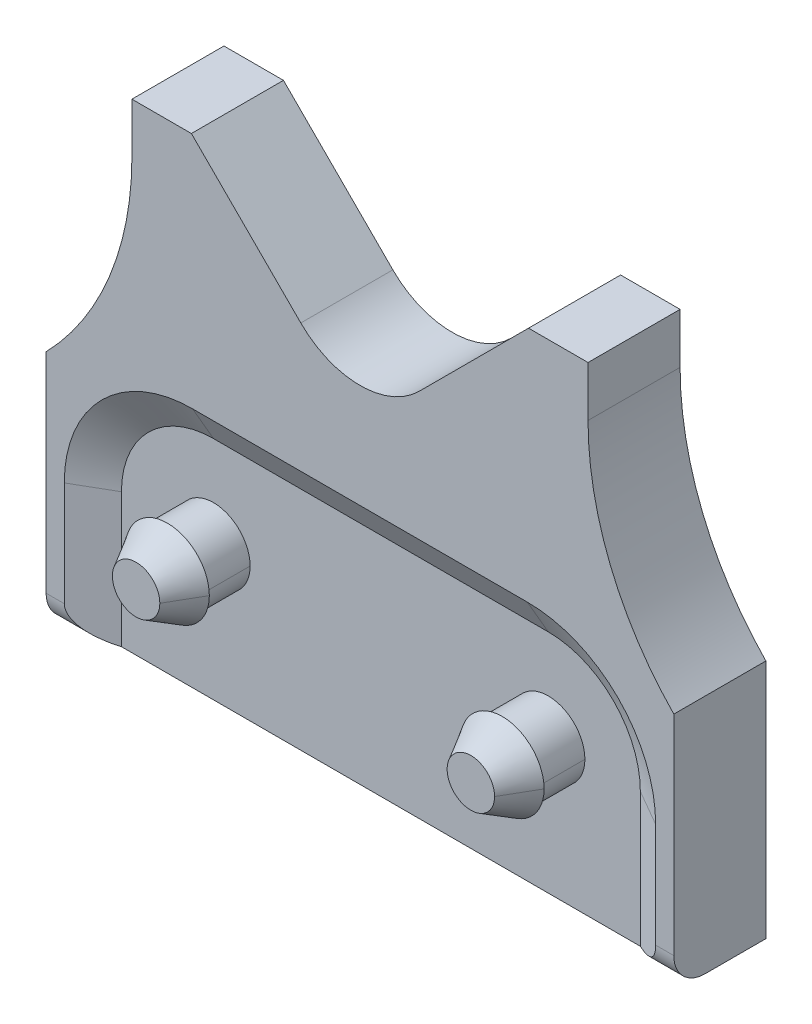
ISO-10303-21;
HEADER;
FILE_DESCRIPTION(('STEP AP214'),'2;1');
FILE_NAME('part.step','',(''),(''),'','','');
FILE_SCHEMA(('AUTOMOTIVE_DESIGN { 1 0 10303 214 1 1 1 1 }'));
ENDSEC;
DATA;
#1=APPLICATION_CONTEXT('core data for automotive mechanical design processes');
#2=APPLICATION_PROTOCOL_DEFINITION('international standard','automotive_design',2000,#1);
#3=PRODUCT_CONTEXT('',#1,'mechanical');
#4=PRODUCT('Part','Part','',(#3));
#5=PRODUCT_RELATED_PRODUCT_CATEGORY('part','',(#4));
#6=PRODUCT_DEFINITION_FORMATION('','',#4);
#7=PRODUCT_DEFINITION_CONTEXT('part definition',#1,'design');
#8=PRODUCT_DEFINITION('design','',#6,#7);
#9=PRODUCT_DEFINITION_SHAPE('','',#8);
#10=(LENGTH_UNIT() NAMED_UNIT(*) SI_UNIT(.MILLI.,.METRE.));
#11=(NAMED_UNIT(*) PLANE_ANGLE_UNIT() SI_UNIT($,.RADIAN.));
#12=(NAMED_UNIT(*) SI_UNIT($,.STERADIAN.) SOLID_ANGLE_UNIT());
#13=UNCERTAINTY_MEASURE_WITH_UNIT(LENGTH_MEASURE(1.E-05),#10,'distance_accuracy_value','');
#14=(GEOMETRIC_REPRESENTATION_CONTEXT(3) GLOBAL_UNCERTAINTY_ASSIGNED_CONTEXT((#13)) GLOBAL_UNIT_ASSIGNED_CONTEXT((#10,
#11,#12)) REPRESENTATION_CONTEXT('',''));
#15=CARTESIAN_POINT('',(0.,0.,0.));
#16=DIRECTION('',(0.,0.,1.));
#17=DIRECTION('',(1.,0.,0.));
#18=AXIS2_PLACEMENT_3D('',#15,#16,#17);
#19=CARTESIAN_POINT('',(-4.,-7.55,-0.5));
#20=DIRECTION('',(0.,0.,-1.));
#21=DIRECTION('',(-1.,0.,0.));
#22=AXIS2_PLACEMENT_3D('',#19,#20,#21);
#23=CYLINDRICAL_SURFACE('',#22,0.375);
#24=CARTESIAN_POINT('',(-4.,-7.55,-0.5));
#25=DIRECTION('',(0.,0.,-1.));
#26=DIRECTION('',(1.,0.,0.));
#27=AXIS2_PLACEMENT_3D('',#24,#25,#26);
#28=CIRCLE('',#27,0.375);
#29=CARTESIAN_POINT('',(-3.625,-7.55,-0.5));
#30=VERTEX_POINT('',#29);
#31=CARTESIAN_POINT('',(-4.375,-7.55,-0.5));
#32=VERTEX_POINT('',#31);
#33=EDGE_CURVE('E41',#30,#32,#28,.T.);
#34=ORIENTED_EDGE('',*,*,#33,.F.);
#35=DIRECTION('',(0.,0.,-1.));
#36=VECTOR('',#35,1.);
#37=CARTESIAN_POINT('',(-3.625,-7.55,-0.5));
#38=LINE('',#37,#36);
#39=CARTESIAN_POINT('',(-3.625,-7.55,-3.2));
#40=VERTEX_POINT('',#39);
#41=EDGE_CURVE('E11',#30,#40,#38,.T.);
#42=ORIENTED_EDGE('',*,*,#41,.T.);
#43=CARTESIAN_POINT('',(-4.,-7.55,-3.2));
#44=DIRECTION('',(0.,0.,1.));
#45=DIRECTION('',(-1.,0.,0.));
#46=AXIS2_PLACEMENT_3D('',#43,#44,#45);
#47=CIRCLE('',#46,0.375);
#48=CARTESIAN_POINT('',(-4.375,-7.55,-3.2));
#49=VERTEX_POINT('',#48);
#50=EDGE_CURVE('E527',#49,#40,#47,.T.);
#51=ORIENTED_EDGE('',*,*,#50,.F.);
#52=DIRECTION('',(0.,0.,-1.));
#53=VECTOR('',#52,1.);
#54=CARTESIAN_POINT('',(-4.375,-7.55,-0.5));
#55=LINE('',#54,#53);
#56=EDGE_CURVE('E328',#32,#49,#55,.T.);
#57=ORIENTED_EDGE('',*,*,#56,.F.);
#58=EDGE_LOOP('',(#34,#42,#51,#57));
#59=FACE_BOUND('',#58,.T.);
#60=ADVANCED_FACE('F17',(#59),#23,.F.);
#61=CARTESIAN_POINT('',(4.,-7.55,-0.5));
#62=DIRECTION('',(0.,0.,-1.));
#63=DIRECTION('',(-1.,0.,0.));
#64=AXIS2_PLACEMENT_3D('',#61,#62,#63);
#65=CYLINDRICAL_SURFACE('',#64,0.375);
#66=CARTESIAN_POINT('',(4.,-7.55,-0.5));
#67=DIRECTION('',(0.,0.,-1.));
#68=DIRECTION('',(1.,0.,0.));
#69=AXIS2_PLACEMENT_3D('',#66,#67,#68);
#70=CIRCLE('',#69,0.375);
#71=CARTESIAN_POINT('',(4.375,-7.55,-0.5));
#72=VERTEX_POINT('',#71);
#73=CARTESIAN_POINT('',(3.625,-7.55,-0.5));
#74=VERTEX_POINT('',#73);
#75=EDGE_CURVE('E324',#72,#74,#70,.T.);
#76=ORIENTED_EDGE('',*,*,#75,.F.);
#77=DIRECTION('',(0.,0.,-1.));
#78=VECTOR('',#77,1.);
#79=CARTESIAN_POINT('',(4.375,-7.55,-0.5));
#80=LINE('',#79,#78);
#81=CARTESIAN_POINT('',(4.375,-7.55,-3.2));
#82=VERTEX_POINT('',#81);
#83=EDGE_CURVE('E21',#72,#82,#80,.T.);
#84=ORIENTED_EDGE('',*,*,#83,.T.);
#85=CARTESIAN_POINT('',(4.,-7.55,-3.2));
#86=DIRECTION('',(0.,0.,1.));
#87=DIRECTION('',(-1.,0.,0.));
#88=AXIS2_PLACEMENT_3D('',#85,#86,#87);
#89=CIRCLE('',#88,0.375);
#90=CARTESIAN_POINT('',(3.625,-7.55,-3.2));
#91=VERTEX_POINT('',#90);
#92=EDGE_CURVE('E407',#91,#82,#89,.T.);
#93=ORIENTED_EDGE('',*,*,#92,.F.);
#94=DIRECTION('',(0.,0.,-1.));
#95=VECTOR('',#94,1.);
#96=CARTESIAN_POINT('',(3.625,-7.55,-0.5));
#97=LINE('',#96,#95);
#98=EDGE_CURVE('E381',#74,#91,#97,.T.);
#99=ORIENTED_EDGE('',*,*,#98,.F.);
#100=EDGE_LOOP('',(#76,#84,#93,#99));
#101=FACE_BOUND('',#100,.T.);
#102=ADVANCED_FACE('F986',(#101),#65,.F.);
#103=CARTESIAN_POINT('',(-4.,-7.55,0.35));
#104=DIRECTION('',(0.,0.,-1.));
#105=DIRECTION('',(-1.,0.,0.));
#106=AXIS2_PLACEMENT_3D('',#103,#104,#105);
#107=CONICAL_SURFACE('',#106,0.566987298107781,0.523598775598299);
#108=CARTESIAN_POINT('',(-4.,-7.55,0.35));
#109=DIRECTION('',(0.,0.,1.));
#110=DIRECTION('',(1.,0.,0.));
#111=AXIS2_PLACEMENT_3D('',#108,#109,#110);
#112=CIRCLE('',#111,0.566987298107781);
#113=CARTESIAN_POINT('',(-3.43301270189222,-7.55,0.35));
#114=VERTEX_POINT('',#113);
#115=CARTESIAN_POINT('',(-4.56698729810778,-7.55,0.35));
#116=VERTEX_POINT('',#115);
#117=EDGE_CURVE('E263',#114,#116,#112,.T.);
#118=ORIENTED_EDGE('',*,*,#117,.F.);
#119=DIRECTION('',(0.5,0.,-0.866025403784439));
#120=VECTOR('',#119,1.);
#121=CARTESIAN_POINT('',(-3.43301270189222,-7.55,0.35));
#122=LINE('',#121,#120);
#123=CARTESIAN_POINT('',(-3.,-7.55,-0.4));
#124=VERTEX_POINT('',#123);
#125=EDGE_CURVE('E419',#114,#124,#122,.T.);
#126=ORIENTED_EDGE('',*,*,#125,.T.);
#127=CARTESIAN_POINT('',(-4.,-7.55,-0.4));
#128=DIRECTION('',(0.,0.,1.));
#129=DIRECTION('',(1.,0.,0.));
#130=AXIS2_PLACEMENT_3D('',#127,#128,#129);
#131=CIRCLE('',#130,1.);
#132=CARTESIAN_POINT('',(-5.,-7.55,-0.4));
#133=VERTEX_POINT('',#132);
#134=EDGE_CURVE('E368',#124,#133,#131,.T.);
#135=ORIENTED_EDGE('',*,*,#134,.T.);
#136=DIRECTION('',(-0.5,0.,-0.866025403784439));
#137=VECTOR('',#136,1.);
#138=CARTESIAN_POINT('',(-4.56698729810778,-7.55,0.35));
#139=LINE('',#138,#137);
#140=EDGE_CURVE('E300',#116,#133,#139,.T.);
#141=ORIENTED_EDGE('',*,*,#140,.F.);
#142=EDGE_LOOP('',(#118,#126,#135,#141));
#143=FACE_BOUND('',#142,.T.);
#144=ADVANCED_FACE('F990',(#143),#107,.T.);
#145=CARTESIAN_POINT('',(4.,-7.55,0.35));
#146=DIRECTION('',(0.,0.,-1.));
#147=DIRECTION('',(-1.,0.,0.));
#148=AXIS2_PLACEMENT_3D('',#145,#146,#147);
#149=CONICAL_SURFACE('',#148,0.566987298107781,0.523598775598299);
#150=CARTESIAN_POINT('',(4.,-7.55,0.35));
#151=DIRECTION('',(0.,0.,1.));
#152=DIRECTION('',(1.,0.,0.));
#153=AXIS2_PLACEMENT_3D('',#150,#151,#152);
#154=CIRCLE('',#153,0.566987298107781);
#155=CARTESIAN_POINT('',(4.56698729810778,-7.55,0.35));
#156=VERTEX_POINT('',#155);
#157=CARTESIAN_POINT('',(3.43301270189222,-7.55,0.35));
#158=VERTEX_POINT('',#157);
#159=EDGE_CURVE('E223',#156,#158,#154,.T.);
#160=ORIENTED_EDGE('',*,*,#159,.F.);
#161=DIRECTION('',(0.5,0.,-0.866025403784439));
#162=VECTOR('',#161,1.);
#163=CARTESIAN_POINT('',(4.56698729810778,-7.55,0.35));
#164=LINE('',#163,#162);
#165=CARTESIAN_POINT('',(5.,-7.55,-0.4));
#166=VERTEX_POINT('',#165);
#167=EDGE_CURVE('E364',#156,#166,#164,.T.);
#168=ORIENTED_EDGE('',*,*,#167,.T.);
#169=CARTESIAN_POINT('',(4.,-7.55,-0.4));
#170=DIRECTION('',(0.,0.,1.));
#171=DIRECTION('',(1.,0.,0.));
#172=AXIS2_PLACEMENT_3D('',#169,#170,#171);
#173=CIRCLE('',#172,1.);
#174=CARTESIAN_POINT('',(3.,-7.55,-0.4));
#175=VERTEX_POINT('',#174);
#176=EDGE_CURVE('E227',#166,#175,#173,.T.);
#177=ORIENTED_EDGE('',*,*,#176,.T.);
#178=DIRECTION('',(-0.5,0.,-0.866025403784439));
#179=VECTOR('',#178,1.);
#180=CARTESIAN_POINT('',(3.43301270189222,-7.55,0.35));
#181=LINE('',#180,#179);
#182=EDGE_CURVE('E268',#158,#175,#181,.T.);
#183=ORIENTED_EDGE('',*,*,#182,.F.);
#184=EDGE_LOOP('',(#160,#168,#177,#183));
#185=FACE_BOUND('',#184,.T.);
#186=ADVANCED_FACE('F1025',(#185),#149,.T.);
#187=CARTESIAN_POINT('',(-4.,-7.55,-5.81));
#188=DIRECTION('',(0.,0.,1.));
#189=DIRECTION('',(1.,0.,0.));
#190=AXIS2_PLACEMENT_3D('',#187,#188,#189);
#191=CYLINDRICAL_SURFACE('',#190,0.875);
#192=CARTESIAN_POINT('',(-4.,-7.55,-1.5));
#193=DIRECTION('',(0.,0.,-1.));
#194=DIRECTION('',(-1.,0.,0.));
#195=AXIS2_PLACEMENT_3D('',#192,#193,#194);
#196=CIRCLE('',#195,0.875);
#197=CARTESIAN_POINT('',(-4.875,-7.55,-1.5));
#198=VERTEX_POINT('',#197);
#199=CARTESIAN_POINT('',(-3.125,-7.55,-1.5));
#200=VERTEX_POINT('',#199);
#201=EDGE_CURVE('E319',#198,#200,#196,.T.);
#202=ORIENTED_EDGE('',*,*,#201,.F.);
#203=DIRECTION('',(0.,0.,1.));
#204=VECTOR('',#203,1.);
#205=CARTESIAN_POINT('',(-4.875,-7.55,-5.81));
#206=LINE('',#205,#204);
#207=CARTESIAN_POINT('',(-4.875,-7.55,-0.4));
#208=VERTEX_POINT('',#207);
#209=EDGE_CURVE('E329',#198,#208,#206,.T.);
#210=ORIENTED_EDGE('',*,*,#209,.T.);
#211=CARTESIAN_POINT('',(-4.,-7.55,-0.4));
#212=DIRECTION('',(0.,0.,1.));
#213=DIRECTION('',(1.,0.,0.));
#214=AXIS2_PLACEMENT_3D('',#211,#212,#213);
#215=CIRCLE('',#214,0.875);
#216=CARTESIAN_POINT('',(-3.125,-7.55,-0.4));
#217=VERTEX_POINT('',#216);
#218=EDGE_CURVE('E285',#217,#208,#215,.T.);
#219=ORIENTED_EDGE('',*,*,#218,.F.);
#220=DIRECTION('',(0.,0.,1.));
#221=VECTOR('',#220,1.);
#222=CARTESIAN_POINT('',(-3.125,-7.55,-5.81));
#223=LINE('',#222,#221);
#224=EDGE_CURVE('E203',#200,#217,#223,.T.);
#225=ORIENTED_EDGE('',*,*,#224,.F.);
#226=EDGE_LOOP('',(#202,#210,#219,#225));
#227=FACE_BOUND('',#226,.T.);
#228=ADVANCED_FACE('F1021',(#227),#191,.T.);
#229=CARTESIAN_POINT('',(4.,-7.55,-5.81));
#230=DIRECTION('',(0.,0.,1.));
#231=DIRECTION('',(1.,0.,0.));
#232=AXIS2_PLACEMENT_3D('',#229,#230,#231);
#233=CYLINDRICAL_SURFACE('',#232,0.875);
#234=CARTESIAN_POINT('',(4.,-7.55,-1.5));
#235=DIRECTION('',(0.,0.,-1.));
#236=DIRECTION('',(-1.,0.,0.));
#237=AXIS2_PLACEMENT_3D('',#234,#235,#236);
#238=CIRCLE('',#237,0.875);
#239=CARTESIAN_POINT('',(3.125,-7.55,-1.5));
#240=VERTEX_POINT('',#239);
#241=CARTESIAN_POINT('',(4.875,-7.55,-1.5));
#242=VERTEX_POINT('',#241);
#243=EDGE_CURVE('E212',#240,#242,#238,.T.);
#244=ORIENTED_EDGE('',*,*,#243,.F.);
#245=DIRECTION('',(0.,0.,1.));
#246=VECTOR('',#245,1.);
#247=CARTESIAN_POINT('',(3.125,-7.55,-5.81));
#248=LINE('',#247,#246);
#249=CARTESIAN_POINT('',(3.125,-7.55,-0.4));
#250=VERTEX_POINT('',#249);
#251=EDGE_CURVE('E198',#240,#250,#248,.T.);
#252=ORIENTED_EDGE('',*,*,#251,.T.);
#253=CARTESIAN_POINT('',(4.,-7.55,-0.4));
#254=DIRECTION('',(0.,0.,1.));
#255=DIRECTION('',(1.,0.,0.));
#256=AXIS2_PLACEMENT_3D('',#253,#254,#255);
#257=CIRCLE('',#256,0.875);
#258=CARTESIAN_POINT('',(4.875,-7.55,-0.4));
#259=VERTEX_POINT('',#258);
#260=EDGE_CURVE('E191',#259,#250,#257,.T.);
#261=ORIENTED_EDGE('',*,*,#260,.F.);
#262=DIRECTION('',(0.,0.,1.));
#263=VECTOR('',#262,1.);
#264=CARTESIAN_POINT('',(4.875,-7.55,-5.81));
#265=LINE('',#264,#263);
#266=EDGE_CURVE('E195',#242,#259,#265,.T.);
#267=ORIENTED_EDGE('',*,*,#266,.F.);
#268=EDGE_LOOP('',(#244,#252,#261,#267));
#269=FACE_BOUND('',#268,.T.);
#270=ADVANCED_FACE('F194',(#269),#233,.T.);
#271=CARTESIAN_POINT('',(12.7,0.,-3.2));
#272=DIRECTION('',(0.,0.,-1.));
#273=DIRECTION('',(0.,-1.,0.));
#274=AXIS2_PLACEMENT_3D('',#271,#272,#273);
#275=PLANE('',#274);
#276=DIRECTION('',(0.,-1.,0.));
#277=VECTOR('',#276,1.);
#278=CARTESIAN_POINT('',(-7.5,-5.0519798099359,-3.2));
#279=LINE('',#278,#277);
#280=CARTESIAN_POINT('',(-7.5,-5.0519798099359,-3.2));
#281=VERTEX_POINT('',#280);
#282=CARTESIAN_POINT('',(-7.5,-10.8,-3.2));
#283=VERTEX_POINT('',#282);
#284=EDGE_CURVE('E273',#281,#283,#279,.T.);
#285=ORIENTED_EDGE('',*,*,#284,.F.);
#286=CARTESIAN_POINT('',(-12.7,0.,-3.2));
#287=DIRECTION('',(0.,0.,-1.));
#288=DIRECTION('',(1.,0.,0.));
#289=AXIS2_PLACEMENT_3D('',#286,#287,#288);
#290=CIRCLE('',#289,7.25);
#291=CARTESIAN_POINT('',(-5.45,0.,-3.2));
#292=VERTEX_POINT('',#291);
#293=EDGE_CURVE('E262',#292,#281,#290,.T.);
#294=ORIENTED_EDGE('',*,*,#293,.F.);
#295=DIRECTION('',(0.,-1.,0.));
#296=VECTOR('',#295,1.);
#297=CARTESIAN_POINT('',(-5.45,1.2,-3.2));
#298=LINE('',#297,#296);
#299=CARTESIAN_POINT('',(-5.45,1.2,-3.2));
#300=VERTEX_POINT('',#299);
#301=EDGE_CURVE('E499',#300,#292,#298,.T.);
#302=ORIENTED_EDGE('',*,*,#301,.F.);
#303=DIRECTION('',(-1.,0.,0.));
#304=VECTOR('',#303,1.);
#305=CARTESIAN_POINT('',(-4.02842712474618,1.2,-3.2));
#306=LINE('',#305,#304);
#307=CARTESIAN_POINT('',(-4.02842712474618,1.2,-3.2));
#308=VERTEX_POINT('',#307);
#309=EDGE_CURVE('E310',#308,#300,#306,.T.);
#310=ORIENTED_EDGE('',*,*,#309,.F.);
#311=DIRECTION('',(-0.707106781186548,0.707106781186547,0.));
#312=VECTOR('',#311,1.);
#313=CARTESIAN_POINT('',(-1.41421356237309,-1.41421356237309,-3.2));
#314=LINE('',#313,#312);
#315=CARTESIAN_POINT('',(-1.41421356237309,-1.41421356237309,-3.2));
#316=VERTEX_POINT('',#315);
#317=EDGE_CURVE('E234',#316,#308,#314,.T.);
#318=ORIENTED_EDGE('',*,*,#317,.F.);
#319=CARTESIAN_POINT('',(0.,0.,-3.2));
#320=DIRECTION('',(0.,0.,-1.));
#321=DIRECTION('',(1.,0.,0.));
#322=AXIS2_PLACEMENT_3D('',#319,#320,#321);
#323=CIRCLE('',#322,2.);
#324=CARTESIAN_POINT('',(1.41421356237309,-1.41421356237309,-3.2));
#325=VERTEX_POINT('',#324);
#326=EDGE_CURVE('E233',#325,#316,#323,.T.);
#327=ORIENTED_EDGE('',*,*,#326,.F.);
#328=DIRECTION('',(-0.707106781186548,-0.707106781186547,0.));
#329=VECTOR('',#328,1.);
#330=CARTESIAN_POINT('',(4.02842712474618,1.2,-3.2));
#331=LINE('',#330,#329);
#332=CARTESIAN_POINT('',(4.02842712474618,1.2,-3.2));
#333=VERTEX_POINT('',#332);
#334=EDGE_CURVE('E412',#333,#325,#331,.T.);
#335=ORIENTED_EDGE('',*,*,#334,.F.);
#336=DIRECTION('',(-1.,0.,0.));
#337=VECTOR('',#336,1.);
#338=CARTESIAN_POINT('',(5.45,1.2,-3.2));
#339=LINE('',#338,#337);
#340=CARTESIAN_POINT('',(5.45,1.2,-3.2));
#341=VERTEX_POINT('',#340);
#342=EDGE_CURVE('E333',#341,#333,#339,.T.);
#343=ORIENTED_EDGE('',*,*,#342,.F.);
#344=DIRECTION('',(0.,1.,0.));
#345=VECTOR('',#344,1.);
#346=CARTESIAN_POINT('',(5.45,0.,-3.2));
#347=LINE('',#346,#345);
#348=CARTESIAN_POINT('',(5.45,0.,-3.2));
#349=VERTEX_POINT('',#348);
#350=EDGE_CURVE('E290',#349,#341,#347,.T.);
#351=ORIENTED_EDGE('',*,*,#350,.F.);
#352=CARTESIAN_POINT('',(12.7,0.,-3.2));
#353=DIRECTION('',(0.,0.,-1.));
#354=DIRECTION('',(1.,0.,0.));
#355=AXIS2_PLACEMENT_3D('',#352,#353,#354);
#356=CIRCLE('',#355,7.25);
#357=CARTESIAN_POINT('',(7.5,-5.0519798099359,-3.2));
#358=VERTEX_POINT('',#357);
#359=EDGE_CURVE('E420',#358,#349,#356,.T.);
#360=ORIENTED_EDGE('',*,*,#359,.F.);
#361=DIRECTION('',(0.,1.,0.));
#362=VECTOR('',#361,1.);
#363=CARTESIAN_POINT('',(7.5,-10.8,-3.2));
#364=LINE('',#363,#362);
#365=CARTESIAN_POINT('',(7.5,-10.8,-3.2));
#366=VERTEX_POINT('',#365);
#367=EDGE_CURVE('E274',#366,#358,#364,.T.);
#368=ORIENTED_EDGE('',*,*,#367,.F.);
#369=DIRECTION('',(1.,0.,0.));
#370=VECTOR('',#369,1.);
#371=CARTESIAN_POINT('',(-7.5,-10.8,-3.2));
#372=LINE('',#371,#370);
#373=EDGE_CURVE('E280',#283,#366,#372,.T.);
#374=ORIENTED_EDGE('',*,*,#373,.F.);
#375=EDGE_LOOP('',(#285,#294,#302,#310,#318,#327,#335,#343,#351,#360,#368,#374));
#376=FACE_BOUND('',#375,.T.);
#377=ORIENTED_EDGE('',*,*,#92,.T.);
#378=CARTESIAN_POINT('',(4.,-7.55,-3.2));
#379=DIRECTION('',(0.,0.,1.));
#380=DIRECTION('',(-1.,0.,0.));
#381=AXIS2_PLACEMENT_3D('',#378,#379,#380);
#382=CIRCLE('',#381,0.375);
#383=EDGE_CURVE('E411',#82,#91,#382,.T.);
#384=ORIENTED_EDGE('',*,*,#383,.T.);
#385=EDGE_LOOP('',(#377,#384));
#386=FACE_BOUND('',#385,.T.);
#387=ORIENTED_EDGE('',*,*,#50,.T.);
#388=CARTESIAN_POINT('',(-4.,-7.55,-3.2));
#389=DIRECTION('',(0.,0.,1.));
#390=DIRECTION('',(-1.,0.,0.));
#391=AXIS2_PLACEMENT_3D('',#388,#389,#390);
#392=CIRCLE('',#391,0.375);
#393=EDGE_CURVE('E514',#40,#49,#392,.T.);
#394=ORIENTED_EDGE('',*,*,#393,.T.);
#395=EDGE_LOOP('',(#387,#394));
#396=FACE_BOUND('',#395,.T.);
#397=ADVANCED_FACE('F726',(#376,#386,#396),#275,.T.);
#398=CARTESIAN_POINT('',(0.,-10.8,-3.2));
#399=DIRECTION('',(0.,-1.,0.));
#400=DIRECTION('',(0.,0.,-1.));
#401=AXIS2_PLACEMENT_3D('',#398,#399,#400);
#402=PLANE('',#401);
#403=DIRECTION('',(0.,0.,1.));
#404=VECTOR('',#403,1.);
#405=CARTESIAN_POINT('',(7.5,-10.8,-3.2));
#406=LINE('',#405,#404);
#407=CARTESIAN_POINT('',(7.5,-10.8,-1.75));
#408=VERTEX_POINT('',#407);
#409=EDGE_CURVE('E279',#366,#408,#406,.T.);
#410=ORIENTED_EDGE('',*,*,#409,.T.);
#411=DIRECTION('',(-1.,0.,0.));
#412=VECTOR('',#411,1.);
#413=CARTESIAN_POINT('',(-7.5,-10.8,-1.75));
#414=LINE('',#413,#412);
#415=CARTESIAN_POINT('',(-7.5,-10.8,-1.75));
#416=VERTEX_POINT('',#415);
#417=EDGE_CURVE('E275',#408,#416,#414,.T.);
#418=ORIENTED_EDGE('',*,*,#417,.T.);
#419=DIRECTION('',(0.,0.,1.));
#420=VECTOR('',#419,1.);
#421=CARTESIAN_POINT('',(-7.5,-10.8,-3.2));
#422=LINE('',#421,#420);
#423=EDGE_CURVE('E349',#283,#416,#422,.T.);
#424=ORIENTED_EDGE('',*,*,#423,.F.);
#425=ORIENTED_EDGE('',*,*,#373,.T.);
#426=EDGE_LOOP('',(#410,#418,#424,#425));
#427=FACE_BOUND('',#426,.T.);
#428=ADVANCED_FACE('F19',(#427),#402,.T.);
#429=CARTESIAN_POINT('',(-7.5,-5.0519798099359,-3.2));
#430=DIRECTION('',(-1.,0.,0.));
#431=DIRECTION('',(0.,0.,1.));
#432=AXIS2_PLACEMENT_3D('',#429,#430,#431);
#433=PLANE('',#432);
#434=ORIENTED_EDGE('',*,*,#423,.T.);
#435=CARTESIAN_POINT('',(-7.5,-10.05,-1.75));
#436=DIRECTION('',(-1.,0.,0.));
#437=DIRECTION('',(0.,-1.,0.));
#438=AXIS2_PLACEMENT_3D('',#435,#436,#437);
#439=CIRCLE('',#438,0.75);
#440=CARTESIAN_POINT('',(-7.5,-10.05,-1.));
#441=VERTEX_POINT('',#440);
#442=EDGE_CURVE('E345',#416,#441,#439,.T.);
#443=ORIENTED_EDGE('',*,*,#442,.T.);
#444=DIRECTION('',(0.,-1.,0.));
#445=VECTOR('',#444,1.);
#446=CARTESIAN_POINT('',(-7.5,-5.0519798099359,-1.));
#447=LINE('',#446,#445);
#448=CARTESIAN_POINT('',(-7.5,-5.0519798099359,-1.));
#449=VERTEX_POINT('',#448);
#450=EDGE_CURVE('E235',#449,#441,#447,.T.);
#451=ORIENTED_EDGE('',*,*,#450,.F.);
#452=DIRECTION('',(0.,0.,1.));
#453=VECTOR('',#452,1.);
#454=CARTESIAN_POINT('',(-7.5,-5.0519798099359,-3.2));
#455=LINE('',#454,#453);
#456=EDGE_CURVE('E238',#281,#449,#455,.T.);
#457=ORIENTED_EDGE('',*,*,#456,.F.);
#458=ORIENTED_EDGE('',*,*,#284,.T.);
#459=EDGE_LOOP('',(#434,#443,#451,#457,#458));
#460=FACE_BOUND('',#459,.T.);
#461=ADVANCED_FACE('F582',(#460),#433,.T.);
#462=CARTESIAN_POINT('',(7.5,-10.8,-3.2));
#463=DIRECTION('',(1.,0.,0.));
#464=DIRECTION('',(0.,1.,0.));
#465=AXIS2_PLACEMENT_3D('',#462,#463,#464);
#466=PLANE('',#465);
#467=DIRECTION('',(0.,1.,0.));
#468=VECTOR('',#467,1.);
#469=CARTESIAN_POINT('',(7.5,-10.8,-1.));
#470=LINE('',#469,#468);
#471=CARTESIAN_POINT('',(7.5,-10.05,-1.));
#472=VERTEX_POINT('',#471);
#473=CARTESIAN_POINT('',(7.5,-5.0519798099359,-1.));
#474=VERTEX_POINT('',#473);
#475=EDGE_CURVE('E363',#472,#474,#470,.T.);
#476=ORIENTED_EDGE('',*,*,#475,.F.);
#477=CARTESIAN_POINT('',(7.5,-10.05,-1.75));
#478=DIRECTION('',(1.,0.,0.));
#479=DIRECTION('',(0.,1.,0.));
#480=AXIS2_PLACEMENT_3D('',#477,#478,#479);
#481=CIRCLE('',#480,0.75);
#482=EDGE_CURVE('E269',#472,#408,#481,.T.);
#483=ORIENTED_EDGE('',*,*,#482,.T.);
#484=ORIENTED_EDGE('',*,*,#409,.F.);
#485=ORIENTED_EDGE('',*,*,#367,.T.);
#486=DIRECTION('',(0.,0.,1.));
#487=VECTOR('',#486,1.);
#488=CARTESIAN_POINT('',(7.5,-5.0519798099359,-3.2));
#489=LINE('',#488,#487);
#490=EDGE_CURVE('E341',#358,#474,#489,.T.);
#491=ORIENTED_EDGE('',*,*,#490,.T.);
#492=EDGE_LOOP('',(#476,#483,#484,#485,#491));
#493=FACE_BOUND('',#492,.T.);
#494=ADVANCED_FACE('F695',(#493),#466,.T.);
#495=CARTESIAN_POINT('',(12.7,0.,-3.2));
#496=DIRECTION('',(0.,0.,1.));
#497=DIRECTION('',(1.,0.,0.));
#498=AXIS2_PLACEMENT_3D('',#495,#496,#497);
#499=CYLINDRICAL_SURFACE('',#498,7.25);
#500=CARTESIAN_POINT('',(12.7,0.,-1.));
#501=DIRECTION('',(0.,0.,-1.));
#502=DIRECTION('',(1.,0.,0.));
#503=AXIS2_PLACEMENT_3D('',#500,#501,#502);
#504=CIRCLE('',#503,7.25);
#505=CARTESIAN_POINT('',(5.45,0.,-1.));
#506=VERTEX_POINT('',#505);
#507=EDGE_CURVE('E492',#474,#506,#504,.T.);
#508=ORIENTED_EDGE('',*,*,#507,.F.);
#509=ORIENTED_EDGE('',*,*,#490,.F.);
#510=ORIENTED_EDGE('',*,*,#359,.T.);
#511=DIRECTION('',(0.,0.,1.));
#512=VECTOR('',#511,1.);
#513=CARTESIAN_POINT('',(5.45,0.,-3.2));
#514=LINE('',#513,#512);
#515=EDGE_CURVE('E294',#349,#506,#514,.T.);
#516=ORIENTED_EDGE('',*,*,#515,.T.);
#517=EDGE_LOOP('',(#508,#509,#510,#516));
#518=FACE_BOUND('',#517,.T.);
#519=ADVANCED_FACE('F698',(#518),#499,.F.);
#520=CARTESIAN_POINT('',(5.45,0.,-3.2));
#521=DIRECTION('',(1.,0.,0.));
#522=DIRECTION('',(0.,1.,0.));
#523=AXIS2_PLACEMENT_3D('',#520,#521,#522);
#524=PLANE('',#523);
#525=DIRECTION('',(0.,1.,0.));
#526=VECTOR('',#525,1.);
#527=CARTESIAN_POINT('',(5.45,0.,-1.));
#528=LINE('',#527,#526);
#529=CARTESIAN_POINT('',(5.45,1.2,-1.));
#530=VERTEX_POINT('',#529);
#531=EDGE_CURVE('E461',#506,#530,#528,.T.);
#532=ORIENTED_EDGE('',*,*,#531,.F.);
#533=ORIENTED_EDGE('',*,*,#515,.F.);
#534=ORIENTED_EDGE('',*,*,#350,.T.);
#535=DIRECTION('',(0.,0.,1.));
#536=VECTOR('',#535,1.);
#537=CARTESIAN_POINT('',(5.45,1.2,-3.2));
#538=LINE('',#537,#536);
#539=EDGE_CURVE('E295',#341,#530,#538,.T.);
#540=ORIENTED_EDGE('',*,*,#539,.T.);
#541=EDGE_LOOP('',(#532,#533,#534,#540));
#542=FACE_BOUND('',#541,.T.);
#543=ADVANCED_FACE('F702',(#542),#524,.T.);
#544=CARTESIAN_POINT('',(5.45,1.2,-3.2));
#545=DIRECTION('',(0.,1.,0.));
#546=DIRECTION('',(1.,0.,0.));
#547=AXIS2_PLACEMENT_3D('',#544,#545,#546);
#548=PLANE('',#547);
#549=DIRECTION('',(-1.,0.,0.));
#550=VECTOR('',#549,1.);
#551=CARTESIAN_POINT('',(5.45,1.2,-1.));
#552=LINE('',#551,#550);
#553=CARTESIAN_POINT('',(4.02842712474618,1.2,-1.));
#554=VERTEX_POINT('',#553);
#555=EDGE_CURVE('E458',#530,#554,#552,.T.);
#556=ORIENTED_EDGE('',*,*,#555,.F.);
#557=ORIENTED_EDGE('',*,*,#539,.F.);
#558=ORIENTED_EDGE('',*,*,#342,.T.);
#559=DIRECTION('',(0.,0.,1.));
#560=VECTOR('',#559,1.);
#561=CARTESIAN_POINT('',(4.02842712474618,1.2,-3.2));
#562=LINE('',#561,#560);
#563=EDGE_CURVE('E337',#333,#554,#562,.T.);
#564=ORIENTED_EDGE('',*,*,#563,.T.);
#565=EDGE_LOOP('',(#556,#557,#558,#564));
#566=FACE_BOUND('',#565,.T.);
#567=ADVANCED_FACE('F707',(#566),#548,.T.);
#568=CARTESIAN_POINT('',(4.02842712474618,1.2,-3.2));
#569=DIRECTION('',(-0.707106781186547,0.707106781186548,0.));
#570=DIRECTION('',(0.,0.,1.));
#571=AXIS2_PLACEMENT_3D('',#568,#569,#570);
#572=PLANE('',#571);
#573=DIRECTION('',(-0.707106781186548,-0.707106781186547,0.));
#574=VECTOR('',#573,1.);
#575=CARTESIAN_POINT('',(4.02842712474618,1.2,-1.));
#576=LINE('',#575,#574);
#577=CARTESIAN_POINT('',(1.41421356237309,-1.41421356237309,-1.));
#578=VERTEX_POINT('',#577);
#579=EDGE_CURVE('E462',#554,#578,#576,.T.);
#580=ORIENTED_EDGE('',*,*,#579,.F.);
#581=ORIENTED_EDGE('',*,*,#563,.F.);
#582=ORIENTED_EDGE('',*,*,#334,.T.);
#583=DIRECTION('',(0.,0.,1.));
#584=VECTOR('',#583,1.);
#585=CARTESIAN_POINT('',(1.41421356237309,-1.41421356237309,-3.2));
#586=LINE('',#585,#584);
#587=EDGE_CURVE('E357',#325,#578,#586,.T.);
#588=ORIENTED_EDGE('',*,*,#587,.T.);
#589=EDGE_LOOP('',(#580,#581,#582,#588));
#590=FACE_BOUND('',#589,.T.);
#591=ADVANCED_FACE('F713',(#590),#572,.T.);
#592=CARTESIAN_POINT('',(0.,0.,-3.2));
#593=DIRECTION('',(0.,0.,1.));
#594=DIRECTION('',(1.,0.,0.));
#595=AXIS2_PLACEMENT_3D('',#592,#593,#594);
#596=CYLINDRICAL_SURFACE('',#595,2.);
#597=CARTESIAN_POINT('',(0.,0.,-1.));
#598=DIRECTION('',(0.,0.,-1.));
#599=DIRECTION('',(1.,0.,0.));
#600=AXIS2_PLACEMENT_3D('',#597,#598,#599);
#601=CIRCLE('',#600,2.);
#602=CARTESIAN_POINT('',(-1.41421356237309,-1.41421356237309,-1.));
#603=VERTEX_POINT('',#602);
#604=EDGE_CURVE('E495',#578,#603,#601,.T.);
#605=ORIENTED_EDGE('',*,*,#604,.F.);
#606=ORIENTED_EDGE('',*,*,#587,.F.);
#607=ORIENTED_EDGE('',*,*,#326,.T.);
#608=DIRECTION('',(0.,0.,1.));
#609=VECTOR('',#608,1.);
#610=CARTESIAN_POINT('',(-1.41421356237309,-1.41421356237309,-3.2));
#611=LINE('',#610,#609);
#612=EDGE_CURVE('E229',#316,#603,#611,.T.);
#613=ORIENTED_EDGE('',*,*,#612,.T.);
#614=EDGE_LOOP('',(#605,#606,#607,#613));
#615=FACE_BOUND('',#614,.T.);
#616=ADVANCED_FACE('F716',(#615),#596,.F.);
#617=CARTESIAN_POINT('',(-1.41421356237309,-1.41421356237309,-3.2));
#618=DIRECTION('',(0.707106781186547,0.707106781186548,0.));
#619=DIRECTION('',(0.,0.,-1.));
#620=AXIS2_PLACEMENT_3D('',#617,#618,#619);
#621=PLANE('',#620);
#622=DIRECTION('',(-0.707106781186548,0.707106781186547,0.));
#623=VECTOR('',#622,1.);
#624=CARTESIAN_POINT('',(-1.41421356237309,-1.41421356237309,-1.));
#625=LINE('',#624,#623);
#626=CARTESIAN_POINT('',(-4.02842712474618,1.2,-1.));
#627=VERTEX_POINT('',#626);
#628=EDGE_CURVE('E373',#603,#627,#625,.T.);
#629=ORIENTED_EDGE('',*,*,#628,.F.);
#630=ORIENTED_EDGE('',*,*,#612,.F.);
#631=ORIENTED_EDGE('',*,*,#317,.T.);
#632=DIRECTION('',(0.,0.,1.));
#633=VECTOR('',#632,1.);
#634=CARTESIAN_POINT('',(-4.02842712474618,1.2,-3.2));
#635=LINE('',#634,#633);
#636=EDGE_CURVE('E317',#308,#627,#635,.T.);
#637=ORIENTED_EDGE('',*,*,#636,.T.);
#638=EDGE_LOOP('',(#629,#630,#631,#637));
#639=FACE_BOUND('',#638,.T.);
#640=ADVANCED_FACE('F720',(#639),#621,.T.);
#641=CARTESIAN_POINT('',(-4.02842712474618,1.2,-3.2));
#642=DIRECTION('',(0.,1.,0.));
#643=DIRECTION('',(1.,0.,0.));
#644=AXIS2_PLACEMENT_3D('',#641,#642,#643);
#645=PLANE('',#644);
#646=DIRECTION('',(-1.,0.,0.));
#647=VECTOR('',#646,1.);
#648=CARTESIAN_POINT('',(-4.02842712474618,1.2,-1.));
#649=LINE('',#648,#647);
#650=CARTESIAN_POINT('',(-5.45,1.2,-1.));
#651=VERTEX_POINT('',#650);
#652=EDGE_CURVE('E369',#627,#651,#649,.T.);
#653=ORIENTED_EDGE('',*,*,#652,.F.);
#654=ORIENTED_EDGE('',*,*,#636,.F.);
#655=ORIENTED_EDGE('',*,*,#309,.T.);
#656=DIRECTION('',(0.,0.,1.));
#657=VECTOR('',#656,1.);
#658=CARTESIAN_POINT('',(-5.45,1.2,-3.2));
#659=LINE('',#658,#657);
#660=EDGE_CURVE('E318',#300,#651,#659,.T.);
#661=ORIENTED_EDGE('',*,*,#660,.T.);
#662=EDGE_LOOP('',(#653,#654,#655,#661));
#663=FACE_BOUND('',#662,.T.);
#664=ADVANCED_FACE('F723',(#663),#645,.T.);
#665=CARTESIAN_POINT('',(-5.45,1.2,-3.2));
#666=DIRECTION('',(-1.,0.,0.));
#667=DIRECTION('',(0.,0.,1.));
#668=AXIS2_PLACEMENT_3D('',#665,#666,#667);
#669=PLANE('',#668);
#670=DIRECTION('',(0.,-1.,0.));
#671=VECTOR('',#670,1.);
#672=CARTESIAN_POINT('',(-5.45,1.2,-1.));
#673=LINE('',#672,#671);
#674=CARTESIAN_POINT('',(-5.45,0.,-1.));
#675=VERTEX_POINT('',#674);
#676=EDGE_CURVE('E374',#651,#675,#673,.T.);
#677=ORIENTED_EDGE('',*,*,#676,.F.);
#678=ORIENTED_EDGE('',*,*,#660,.F.);
#679=ORIENTED_EDGE('',*,*,#301,.T.);
#680=DIRECTION('',(0.,0.,1.));
#681=VECTOR('',#680,1.);
#682=CARTESIAN_POINT('',(-5.45,0.,-3.2));
#683=LINE('',#682,#681);
#684=EDGE_CURVE('E451',#292,#675,#683,.T.);
#685=ORIENTED_EDGE('',*,*,#684,.T.);
#686=EDGE_LOOP('',(#677,#678,#679,#685));
#687=FACE_BOUND('',#686,.T.);
#688=ADVANCED_FACE('F576',(#687),#669,.T.);
#689=CARTESIAN_POINT('',(-12.7,0.,-3.2));
#690=DIRECTION('',(0.,0.,1.));
#691=DIRECTION('',(1.,0.,0.));
#692=AXIS2_PLACEMENT_3D('',#689,#690,#691);
#693=CYLINDRICAL_SURFACE('',#692,7.25);
#694=CARTESIAN_POINT('',(-12.7,0.,-1.));
#695=DIRECTION('',(0.,0.,-1.));
#696=DIRECTION('',(1.,0.,0.));
#697=AXIS2_PLACEMENT_3D('',#694,#695,#696);
#698=CIRCLE('',#697,7.25);
#699=EDGE_CURVE('E474',#675,#449,#698,.T.);
#700=ORIENTED_EDGE('',*,*,#699,.F.);
#701=ORIENTED_EDGE('',*,*,#684,.F.);
#702=ORIENTED_EDGE('',*,*,#293,.T.);
#703=ORIENTED_EDGE('',*,*,#456,.T.);
#704=EDGE_LOOP('',(#700,#701,#702,#703));
#705=FACE_BOUND('',#704,.T.);
#706=ADVANCED_FACE('F578',(#705),#693,.F.);
#707=CARTESIAN_POINT('',(12.7,0.,-1.));
#708=DIRECTION('',(0.,0.,-1.));
#709=DIRECTION('',(0.,-1.,0.));
#710=AXIS2_PLACEMENT_3D('',#707,#708,#709);
#711=PLANE('',#710);
#712=ORIENTED_EDGE('',*,*,#450,.T.);
#713=DIRECTION('',(1.,0.,0.));
#714=VECTOR('',#713,1.);
#715=CARTESIAN_POINT('',(-7.06602540378444,-10.05,-1.));
#716=LINE('',#715,#714);
#717=CARTESIAN_POINT('',(-7.06602540378444,-10.05,-1.));
#718=VERTEX_POINT('',#717);
#719=EDGE_CURVE('E239',#441,#718,#716,.T.);
#720=ORIENTED_EDGE('',*,*,#719,.T.);
#721=DIRECTION('',(0.,1.,0.));
#722=VECTOR('',#721,1.);
#723=CARTESIAN_POINT('',(-7.06602540378444,0.,-1.));
#724=LINE('',#723,#722);
#725=CARTESIAN_POINT('',(-7.06602540378444,-7.55,-1.));
#726=VERTEX_POINT('',#725);
#727=EDGE_CURVE('E378',#718,#726,#724,.T.);
#728=ORIENTED_EDGE('',*,*,#727,.T.);
#729=CARTESIAN_POINT('',(-4.,-7.55,-1.));
#730=DIRECTION('',(0.,0.,-1.));
#731=DIRECTION('',(-1.,0.,0.));
#732=AXIS2_PLACEMENT_3D('',#729,#730,#731);
#733=CIRCLE('',#732,3.06602540378443);
#734=CARTESIAN_POINT('',(-4.,-4.48397459621556,-1.));
#735=VERTEX_POINT('',#734);
#736=EDGE_CURVE('E244',#726,#735,#733,.T.);
#737=ORIENTED_EDGE('',*,*,#736,.T.);
#738=DIRECTION('',(1.,0.,0.));
#739=VECTOR('',#738,1.);
#740=CARTESIAN_POINT('',(12.7,-4.48397459621556,-1.));
#741=LINE('',#740,#739);
#742=CARTESIAN_POINT('',(4.,-4.48397459621556,-1.));
#743=VERTEX_POINT('',#742);
#744=EDGE_CURVE('E240',#735,#743,#741,.T.);
#745=ORIENTED_EDGE('',*,*,#744,.T.);
#746=CARTESIAN_POINT('',(4.,-7.55,-1.));
#747=DIRECTION('',(0.,0.,-1.));
#748=DIRECTION('',(-1.,0.,0.));
#749=AXIS2_PLACEMENT_3D('',#746,#747,#748);
#750=CIRCLE('',#749,3.06602540378444);
#751=CARTESIAN_POINT('',(7.06602540378444,-7.55000000000085,-1.));
#752=VERTEX_POINT('',#751);
#753=EDGE_CURVE('E245',#743,#752,#750,.T.);
#754=ORIENTED_EDGE('',*,*,#753,.T.);
#755=DIRECTION('',(0.,-1.,0.));
#756=VECTOR('',#755,1.);
#757=CARTESIAN_POINT('',(7.06602540378444,0.,-1.));
#758=LINE('',#757,#756);
#759=CARTESIAN_POINT('',(7.06602540378444,-10.05,-1.));
#760=VERTEX_POINT('',#759);
#761=EDGE_CURVE('E362',#752,#760,#758,.T.);
#762=ORIENTED_EDGE('',*,*,#761,.T.);
#763=DIRECTION('',(1.,0.,0.));
#764=VECTOR('',#763,1.);
#765=CARTESIAN_POINT('',(7.28301270189222,-10.05,-1.));
#766=LINE('',#765,#764);
#767=EDGE_CURVE('E358',#760,#472,#766,.T.);
#768=ORIENTED_EDGE('',*,*,#767,.T.);
#769=ORIENTED_EDGE('',*,*,#475,.T.);
#770=ORIENTED_EDGE('',*,*,#507,.T.);
#771=ORIENTED_EDGE('',*,*,#531,.T.);
#772=ORIENTED_EDGE('',*,*,#555,.T.);
#773=ORIENTED_EDGE('',*,*,#579,.T.);
#774=ORIENTED_EDGE('',*,*,#604,.T.);
#775=ORIENTED_EDGE('',*,*,#628,.T.);
#776=ORIENTED_EDGE('',*,*,#652,.T.);
#777=ORIENTED_EDGE('',*,*,#676,.T.);
#778=ORIENTED_EDGE('',*,*,#699,.T.);
#779=EDGE_LOOP('',(#712,#720,#728,#737,#745,#754,#762,#768,#769,#770,#771,#772,#773,#774,#775,
#776,#777,#778));
#780=FACE_BOUND('',#779,.T.);
#781=ADVANCED_FACE('F570',(#780),#711,.F.);
#782=CARTESIAN_POINT('',(-6.2,-10.8,-1.5));
#783=DIRECTION('',(0.5,0.,0.866025403784439));
#784=DIRECTION('',(0.,-1.,0.));
#785=AXIS2_PLACEMENT_3D('',#782,#783,#784);
#786=PLANE('',#785);
#787=ORIENTED_EDGE('',*,*,#727,.F.);
#788=CARTESIAN_POINT('',(-7.06602540378444,-10.05,-1.));
#789=CARTESIAN_POINT('',(-7.06602540378444,-10.3789128951532,-1.));
#790=CARTESIAN_POINT('',(-6.73711250863124,-10.6474691494688,-1.18989794855663));
#791=CARTESIAN_POINT('',(-6.2,-10.7571067811865,-1.5));
#792=(BOUNDED_CURVE() B_SPLINE_CURVE(3,(#788,#789,#790,#791),.UNSPECIFIED.,.F.,
.F.) B_SPLINE_CURVE_WITH_KNOTS((4,4),(0.,1.23095941734077),
.UNSPECIFIED.) CURVE() GEOMETRIC_REPRESENTATION_ITEM() RATIONAL_B_SPLINE_CURVE((1.,
0.877664387285152,0.877664387285152,1.)) REPRESENTATION_ITEM(''));
#793=CARTESIAN_POINT('',(-6.2,-10.7571067811865,-1.5));
#794=VERTEX_POINT('',#793);
#795=EDGE_CURVE('E447',#718,#794,#792,.T.);
#796=ORIENTED_EDGE('',*,*,#795,.T.);
#797=DIRECTION('',(0.,-1.,0.));
#798=VECTOR('',#797,1.);
#799=CARTESIAN_POINT('',(-6.2,-10.8,-1.5));
#800=LINE('',#799,#798);
#801=CARTESIAN_POINT('',(-6.2,-7.55,-1.5));
#802=VERTEX_POINT('',#801);
#803=EDGE_CURVE('E248',#802,#794,#800,.T.);
#804=ORIENTED_EDGE('',*,*,#803,.F.);
#805=DIRECTION('',(-0.866025403784439,0.,0.5));
#806=VECTOR('',#805,1.);
#807=CARTESIAN_POINT('',(-6.2,-7.55,-1.5));
#808=LINE('',#807,#806);
#809=EDGE_CURVE('E353',#802,#726,#808,.T.);
#810=ORIENTED_EDGE('',*,*,#809,.T.);
#811=EDGE_LOOP('',(#787,#796,#804,#810));
#812=FACE_BOUND('',#811,.T.);
#813=ADVANCED_FACE('F671',(#812),#786,.T.);
#814=CARTESIAN_POINT('',(-4.,-7.55,-1.5));
#815=DIRECTION('',(0.,0.,1.));
#816=DIRECTION('',(-1.,0.,0.));
#817=AXIS2_PLACEMENT_3D('',#814,#815,#816);
#818=CONICAL_SURFACE('',#817,2.2,1.0471975511966);
#819=CARTESIAN_POINT('',(-4.,-7.55,-1.5));
#820=DIRECTION('',(0.,0.,1.));
#821=DIRECTION('',(-1.,0.,0.));
#822=AXIS2_PLACEMENT_3D('',#819,#820,#821);
#823=CIRCLE('',#822,2.2);
#824=CARTESIAN_POINT('',(-4.,-5.35,-1.5));
#825=VERTEX_POINT('',#824);
#826=EDGE_CURVE('E384',#825,#802,#823,.T.);
#827=ORIENTED_EDGE('',*,*,#826,.F.);
#828=DIRECTION('',(0.,0.866025403784439,0.5));
#829=VECTOR('',#828,1.);
#830=CARTESIAN_POINT('',(-4.,-5.35,-1.5));
#831=LINE('',#830,#829);
#832=EDGE_CURVE('E299',#825,#735,#831,.T.);
#833=ORIENTED_EDGE('',*,*,#832,.T.);
#834=ORIENTED_EDGE('',*,*,#736,.F.);
#835=ORIENTED_EDGE('',*,*,#809,.F.);
#836=EDGE_LOOP('',(#827,#833,#834,#835));
#837=FACE_BOUND('',#836,.T.);
#838=ADVANCED_FACE('F682',(#837),#818,.F.);
#839=CARTESIAN_POINT('',(-4.,-5.35,-1.5));
#840=DIRECTION('',(0.,-0.5,0.866025403784439));
#841=DIRECTION('',(-1.,0.,0.));
#842=AXIS2_PLACEMENT_3D('',#839,#840,#841);
#843=PLANE('',#842);
#844=DIRECTION('',(-1.,0.,0.));
#845=VECTOR('',#844,1.);
#846=CARTESIAN_POINT('',(-4.,-5.35,-1.5));
#847=LINE('',#846,#845);
#848=CARTESIAN_POINT('',(4.,-5.35,-1.5));
#849=VERTEX_POINT('',#848);
#850=EDGE_CURVE('E391',#849,#825,#847,.T.);
#851=ORIENTED_EDGE('',*,*,#850,.F.);
#852=DIRECTION('',(0.,0.866025403784439,0.5));
#853=VECTOR('',#852,1.);
#854=CARTESIAN_POINT('',(4.,-5.35,-1.5));
#855=LINE('',#854,#853);
#856=EDGE_CURVE('E258',#849,#743,#855,.T.);
#857=ORIENTED_EDGE('',*,*,#856,.T.);
#858=ORIENTED_EDGE('',*,*,#744,.F.);
#859=ORIENTED_EDGE('',*,*,#832,.F.);
#860=EDGE_LOOP('',(#851,#857,#858,#859));
#861=FACE_BOUND('',#860,.T.);
#862=ADVANCED_FACE('F686',(#861),#843,.T.);
#863=CARTESIAN_POINT('',(4.,-7.55,-1.5));
#864=DIRECTION('',(0.,0.,1.));
#865=DIRECTION('',(-1.,0.,0.));
#866=AXIS2_PLACEMENT_3D('',#863,#864,#865);
#867=CONICAL_SURFACE('',#866,2.2,1.0471975511966);
#868=CARTESIAN_POINT('',(4.,-7.55,-1.5));
#869=DIRECTION('',(0.,0.,1.));
#870=DIRECTION('',(-1.,0.,0.));
#871=AXIS2_PLACEMENT_3D('',#868,#869,#870);
#872=CIRCLE('',#871,2.2);
#873=CARTESIAN_POINT('',(6.2,-7.55000000000061,-1.5));
#874=VERTEX_POINT('',#873);
#875=EDGE_CURVE('E400',#874,#849,#872,.T.);
#876=ORIENTED_EDGE('',*,*,#875,.F.);
#877=DIRECTION('',(0.866025403784439,-2.39687465525792E-13,0.5));
#878=VECTOR('',#877,1.);
#879=CARTESIAN_POINT('',(6.2,-7.55000000000061,-1.5));
#880=LINE('',#879,#878);
#881=EDGE_CURVE('E254',#874,#752,#880,.T.);
#882=ORIENTED_EDGE('',*,*,#881,.T.);
#883=ORIENTED_EDGE('',*,*,#753,.F.);
#884=ORIENTED_EDGE('',*,*,#856,.F.);
#885=EDGE_LOOP('',(#876,#882,#883,#884));
#886=FACE_BOUND('',#885,.T.);
#887=ADVANCED_FACE('F688',(#886),#867,.F.);
#888=CARTESIAN_POINT('',(6.2,-7.55,-1.5));
#889=DIRECTION('',(-0.5,0.,0.866025403784439));
#890=DIRECTION('',(0.,1.,0.));
#891=AXIS2_PLACEMENT_3D('',#888,#889,#890);
#892=PLANE('',#891);
#893=DIRECTION('',(0.,1.,0.));
#894=VECTOR('',#893,1.);
#895=CARTESIAN_POINT('',(6.2,-7.55,-1.5));
#896=LINE('',#895,#894);
#897=CARTESIAN_POINT('',(6.2,-10.7571067811865,-1.5));
#898=VERTEX_POINT('',#897);
#899=EDGE_CURVE('E284',#898,#874,#896,.T.);
#900=ORIENTED_EDGE('',*,*,#899,.F.);
#901=CARTESIAN_POINT('',(6.2,-10.7571067811865,-1.5));
#902=CARTESIAN_POINT('',(6.73711250863124,-10.6474691494688,-1.18989794855663));
#903=CARTESIAN_POINT('',(7.06602540378444,-10.3789128951532,-1.));
#904=CARTESIAN_POINT('',(7.06602540378444,-10.05,-1.));
#905=(BOUNDED_CURVE() B_SPLINE_CURVE(3,(#901,#902,#903,#904),.UNSPECIFIED.,.F.,
.F.) B_SPLINE_CURVE_WITH_KNOTS((4,4),(1.91063323624902,3.1415926535898),
.UNSPECIFIED.) CURVE() GEOMETRIC_REPRESENTATION_ITEM() RATIONAL_B_SPLINE_CURVE((1.,
0.877664387285152,0.877664387285152,1.)) REPRESENTATION_ITEM(''));
#906=EDGE_CURVE('E252',#898,#760,#905,.T.);
#907=ORIENTED_EDGE('',*,*,#906,.T.);
#908=ORIENTED_EDGE('',*,*,#761,.F.);
#909=ORIENTED_EDGE('',*,*,#881,.F.);
#910=EDGE_LOOP('',(#900,#907,#908,#909));
#911=FACE_BOUND('',#910,.T.);
#912=ADVANCED_FACE('F691',(#911),#892,.T.);
#913=CARTESIAN_POINT('',(-4.,-7.55,-1.5));
#914=DIRECTION('',(0.,0.,-1.));
#915=DIRECTION('',(0.,-1.,0.));
#916=AXIS2_PLACEMENT_3D('',#913,#914,#915);
#917=PLANE('',#916);
#918=ORIENTED_EDGE('',*,*,#803,.T.);
#919=DIRECTION('',(1.,0.,0.));
#920=VECTOR('',#919,1.);
#921=CARTESIAN_POINT('',(-6.2,-10.7571067811865,-1.5));
#922=LINE('',#921,#920);
#923=EDGE_CURVE('E253',#794,#898,#922,.T.);
#924=ORIENTED_EDGE('',*,*,#923,.T.);
#925=ORIENTED_EDGE('',*,*,#899,.T.);
#926=ORIENTED_EDGE('',*,*,#875,.T.);
#927=ORIENTED_EDGE('',*,*,#850,.T.);
#928=ORIENTED_EDGE('',*,*,#826,.T.);
#929=EDGE_LOOP('',(#918,#924,#925,#926,#927,#928));
#930=FACE_BOUND('',#929,.T.);
#931=CARTESIAN_POINT('',(-4.,-7.55,-1.5));
#932=DIRECTION('',(0.,0.,-1.));
#933=DIRECTION('',(-1.,0.,0.));
#934=AXIS2_PLACEMENT_3D('',#931,#932,#933);
#935=CIRCLE('',#934,0.875);
#936=EDGE_CURVE('E323',#200,#198,#935,.T.);
#937=ORIENTED_EDGE('',*,*,#936,.T.);
#938=ORIENTED_EDGE('',*,*,#201,.T.);
#939=EDGE_LOOP('',(#937,#938));
#940=FACE_BOUND('',#939,.T.);
#941=CARTESIAN_POINT('',(4.,-7.55,-1.5));
#942=DIRECTION('',(0.,0.,-1.));
#943=DIRECTION('',(-1.,0.,0.));
#944=AXIS2_PLACEMENT_3D('',#941,#942,#943);
#945=CIRCLE('',#944,0.875);
#946=EDGE_CURVE('E210',#242,#240,#945,.T.);
#947=ORIENTED_EDGE('',*,*,#946,.T.);
#948=ORIENTED_EDGE('',*,*,#243,.T.);
#949=EDGE_LOOP('',(#947,#948));
#950=FACE_BOUND('',#949,.T.);
#951=ADVANCED_FACE('F680',(#930,#940,#950),#917,.F.);
#952=CARTESIAN_POINT('',(4.,-7.55,-5.81));
#953=DIRECTION('',(0.,0.,1.));
#954=DIRECTION('',(1.,0.,0.));
#955=AXIS2_PLACEMENT_3D('',#952,#953,#954);
#956=CYLINDRICAL_SURFACE('',#955,0.875);
#957=ORIENTED_EDGE('',*,*,#251,.F.);
#958=ORIENTED_EDGE('',*,*,#946,.F.);
#959=ORIENTED_EDGE('',*,*,#266,.T.);
#960=CARTESIAN_POINT('',(4.,-7.55,-0.4));
#961=DIRECTION('',(0.,0.,1.));
#962=DIRECTION('',(1.,0.,0.));
#963=AXIS2_PLACEMENT_3D('',#960,#961,#962);
#964=CIRCLE('',#963,0.875);
#965=EDGE_CURVE('E204',#250,#259,#964,.T.);
#966=ORIENTED_EDGE('',*,*,#965,.F.);
#967=EDGE_LOOP('',(#957,#958,#959,#966));
#968=FACE_BOUND('',#967,.T.);
#969=ADVANCED_FACE('F208',(#968),#956,.T.);
#970=CARTESIAN_POINT('',(-4.,-7.55,-5.81));
#971=DIRECTION('',(0.,0.,1.));
#972=DIRECTION('',(1.,0.,0.));
#973=AXIS2_PLACEMENT_3D('',#970,#971,#972);
#974=CYLINDRICAL_SURFACE('',#973,0.875);
#975=ORIENTED_EDGE('',*,*,#209,.F.);
#976=ORIENTED_EDGE('',*,*,#936,.F.);
#977=ORIENTED_EDGE('',*,*,#224,.T.);
#978=CARTESIAN_POINT('',(-4.,-7.55,-0.4));
#979=DIRECTION('',(0.,0.,1.));
#980=DIRECTION('',(1.,0.,0.));
#981=AXIS2_PLACEMENT_3D('',#978,#979,#980);
#982=CIRCLE('',#981,0.875);
#983=EDGE_CURVE('E289',#208,#217,#982,.T.);
#984=ORIENTED_EDGE('',*,*,#983,.F.);
#985=EDGE_LOOP('',(#975,#976,#977,#984));
#986=FACE_BOUND('',#985,.T.);
#987=ADVANCED_FACE('F1102',(#986),#974,.T.);
#988=CARTESIAN_POINT('',(4.,-7.55,-0.4));
#989=DIRECTION('',(0.,0.,1.));
#990=DIRECTION('',(1.,0.,0.));
#991=AXIS2_PLACEMENT_3D('',#988,#989,#990);
#992=PLANE('',#991);
#993=CARTESIAN_POINT('',(4.,-7.55,-0.4));
#994=DIRECTION('',(0.,0.,1.));
#995=DIRECTION('',(1.,0.,0.));
#996=AXIS2_PLACEMENT_3D('',#993,#994,#995);
#997=CIRCLE('',#996,1.);
#998=EDGE_CURVE('E303',#175,#166,#997,.T.);
#999=ORIENTED_EDGE('',*,*,#998,.F.);
#1000=ORIENTED_EDGE('',*,*,#176,.F.);
#1001=EDGE_LOOP('',(#999,#1000));
#1002=FACE_BOUND('',#1001,.T.);
#1003=ORIENTED_EDGE('',*,*,#260,.T.);
#1004=ORIENTED_EDGE('',*,*,#965,.T.);
#1005=EDGE_LOOP('',(#1003,#1004));
#1006=FACE_BOUND('',#1005,.T.);
#1007=ADVANCED_FACE('F214',(#1002,#1006),#992,.F.);
#1008=CARTESIAN_POINT('',(4.,-7.55,0.35));
#1009=DIRECTION('',(0.,0.,1.));
#1010=DIRECTION('',(1.,0.,0.));
#1011=AXIS2_PLACEMENT_3D('',#1008,#1009,#1010);
#1012=PLANE('',#1011);
#1013=CARTESIAN_POINT('',(4.,-7.55,0.35));
#1014=DIRECTION('',(0.,0.,1.));
#1015=DIRECTION('',(1.,0.,0.));
#1016=AXIS2_PLACEMENT_3D('',#1013,#1014,#1015);
#1017=CIRCLE('',#1016,0.566987298107781);
#1018=EDGE_CURVE('E216',#158,#156,#1017,.T.);
#1019=ORIENTED_EDGE('',*,*,#1018,.T.);
#1020=ORIENTED_EDGE('',*,*,#159,.T.);
#1021=EDGE_LOOP('',(#1019,#1020));
#1022=FACE_BOUND('',#1021,.T.);
#1023=ADVANCED_FACE('F1050',(#1022),#1012,.T.);
#1024=CARTESIAN_POINT('',(-4.,-7.55,-0.4));
#1025=DIRECTION('',(0.,0.,1.));
#1026=DIRECTION('',(1.,0.,0.));
#1027=AXIS2_PLACEMENT_3D('',#1024,#1025,#1026);
#1028=PLANE('',#1027);
#1029=CARTESIAN_POINT('',(-4.,-7.55,-0.4));
#1030=DIRECTION('',(0.,0.,1.));
#1031=DIRECTION('',(1.,0.,0.));
#1032=AXIS2_PLACEMENT_3D('',#1029,#1030,#1031);
#1033=CIRCLE('',#1032,1.);
#1034=EDGE_CURVE('E304',#133,#124,#1033,.T.);
#1035=ORIENTED_EDGE('',*,*,#1034,.F.);
#1036=ORIENTED_EDGE('',*,*,#134,.F.);
#1037=EDGE_LOOP('',(#1035,#1036));
#1038=FACE_BOUND('',#1037,.T.);
#1039=ORIENTED_EDGE('',*,*,#218,.T.);
#1040=ORIENTED_EDGE('',*,*,#983,.T.);
#1041=EDGE_LOOP('',(#1039,#1040));
#1042=FACE_BOUND('',#1041,.T.);
#1043=ADVANCED_FACE('F1045',(#1038,#1042),#1028,.F.);
#1044=CARTESIAN_POINT('',(-4.,-7.55,0.35));
#1045=DIRECTION('',(0.,0.,1.));
#1046=DIRECTION('',(1.,0.,0.));
#1047=AXIS2_PLACEMENT_3D('',#1044,#1045,#1046);
#1048=PLANE('',#1047);
#1049=CARTESIAN_POINT('',(-4.,-7.55,0.35));
#1050=DIRECTION('',(0.,0.,1.));
#1051=DIRECTION('',(1.,0.,0.));
#1052=AXIS2_PLACEMENT_3D('',#1049,#1050,#1051);
#1053=CIRCLE('',#1052,0.566987298107781);
#1054=EDGE_CURVE('E267',#116,#114,#1053,.T.);
#1055=ORIENTED_EDGE('',*,*,#1054,.T.);
#1056=ORIENTED_EDGE('',*,*,#117,.T.);
#1057=EDGE_LOOP('',(#1055,#1056));
#1058=FACE_BOUND('',#1057,.T.);
#1059=ADVANCED_FACE('F1049',(#1058),#1048,.T.);
#1060=CARTESIAN_POINT('',(4.,-7.55,0.35));
#1061=DIRECTION('',(0.,0.,-1.));
#1062=DIRECTION('',(-1.,0.,0.));
#1063=AXIS2_PLACEMENT_3D('',#1060,#1061,#1062);
#1064=CONICAL_SURFACE('',#1063,0.566987298107781,0.523598775598299);
#1065=ORIENTED_EDGE('',*,*,#167,.F.);
#1066=ORIENTED_EDGE('',*,*,#1018,.F.);
#1067=ORIENTED_EDGE('',*,*,#182,.T.);
#1068=ORIENTED_EDGE('',*,*,#998,.T.);
#1069=EDGE_LOOP('',(#1065,#1066,#1067,#1068));
#1070=FACE_BOUND('',#1069,.T.);
#1071=ADVANCED_FACE('F1008',(#1070),#1064,.T.);
#1072=CARTESIAN_POINT('',(-4.,-7.55,0.35));
#1073=DIRECTION('',(0.,0.,-1.));
#1074=DIRECTION('',(-1.,0.,0.));
#1075=AXIS2_PLACEMENT_3D('',#1072,#1073,#1074);
#1076=CONICAL_SURFACE('',#1075,0.566987298107781,0.523598775598299);
#1077=ORIENTED_EDGE('',*,*,#125,.F.);
#1078=ORIENTED_EDGE('',*,*,#1054,.F.);
#1079=ORIENTED_EDGE('',*,*,#140,.T.);
#1080=ORIENTED_EDGE('',*,*,#1034,.T.);
#1081=EDGE_LOOP('',(#1077,#1078,#1079,#1080));
#1082=FACE_BOUND('',#1081,.T.);
#1083=ADVANCED_FACE('F1003',(#1082),#1076,.T.);
#1084=CARTESIAN_POINT('',(4.,-7.55,-0.5));
#1085=DIRECTION('',(0.,0.,-1.));
#1086=DIRECTION('',(-1.,0.,0.));
#1087=AXIS2_PLACEMENT_3D('',#1084,#1085,#1086);
#1088=CYLINDRICAL_SURFACE('',#1087,0.375);
#1089=ORIENTED_EDGE('',*,*,#83,.F.);
#1090=CARTESIAN_POINT('',(4.,-7.55,-0.5));
#1091=DIRECTION('',(0.,0.,-1.));
#1092=DIRECTION('',(1.,0.,0.));
#1093=AXIS2_PLACEMENT_3D('',#1090,#1091,#1092);
#1094=CIRCLE('',#1093,0.375);
#1095=EDGE_CURVE('E327',#74,#72,#1094,.T.);
#1096=ORIENTED_EDGE('',*,*,#1095,.F.);
#1097=ORIENTED_EDGE('',*,*,#98,.T.);
#1098=ORIENTED_EDGE('',*,*,#383,.F.);
#1099=EDGE_LOOP('',(#1089,#1096,#1097,#1098));
#1100=FACE_BOUND('',#1099,.T.);
#1101=ADVANCED_FACE('F1007',(#1100),#1088,.F.);
#1102=CARTESIAN_POINT('',(4.,-7.55,-0.5));
#1103=DIRECTION('',(0.,0.,1.));
#1104=DIRECTION('',(1.,0.,0.));
#1105=AXIS2_PLACEMENT_3D('',#1102,#1103,#1104);
#1106=PLANE('',#1105);
#1107=ORIENTED_EDGE('',*,*,#1095,.T.);
#1108=ORIENTED_EDGE('',*,*,#75,.T.);
#1109=EDGE_LOOP('',(#1107,#1108));
#1110=FACE_BOUND('',#1109,.T.);
#1111=ADVANCED_FACE('F1056',(#1110),#1106,.F.);
#1112=CARTESIAN_POINT('',(-4.,-7.55,-0.5));
#1113=DIRECTION('',(0.,0.,-1.));
#1114=DIRECTION('',(-1.,0.,0.));
#1115=AXIS2_PLACEMENT_3D('',#1112,#1113,#1114);
#1116=CYLINDRICAL_SURFACE('',#1115,0.375);
#1117=ORIENTED_EDGE('',*,*,#41,.F.);
#1118=CARTESIAN_POINT('',(-4.,-7.55,-0.5));
#1119=DIRECTION('',(0.,0.,-1.));
#1120=DIRECTION('',(1.,0.,0.));
#1121=AXIS2_PLACEMENT_3D('',#1118,#1119,#1120);
#1122=CIRCLE('',#1121,0.375);
#1123=EDGE_CURVE('E432',#32,#30,#1122,.T.);
#1124=ORIENTED_EDGE('',*,*,#1123,.F.);
#1125=ORIENTED_EDGE('',*,*,#56,.T.);
#1126=ORIENTED_EDGE('',*,*,#393,.F.);
#1127=EDGE_LOOP('',(#1117,#1124,#1125,#1126));
#1128=FACE_BOUND('',#1127,.T.);
#1129=ADVANCED_FACE('F1060',(#1128),#1116,.F.);
#1130=CARTESIAN_POINT('',(-4.,-7.55,-0.5));
#1131=DIRECTION('',(0.,0.,1.));
#1132=DIRECTION('',(1.,0.,0.));
#1133=AXIS2_PLACEMENT_3D('',#1130,#1131,#1132);
#1134=PLANE('',#1133);
#1135=ORIENTED_EDGE('',*,*,#1123,.T.);
#1136=ORIENTED_EDGE('',*,*,#33,.T.);
#1137=EDGE_LOOP('',(#1135,#1136));
#1138=FACE_BOUND('',#1137,.T.);
#1139=ADVANCED_FACE('F1144',(#1138),#1134,.F.);
#1140=CARTESIAN_POINT('',(12.7,-10.05,-1.75));
#1141=DIRECTION('',(-1.,0.,0.));
#1142=DIRECTION('',(0.,-1.,0.));
#1143=AXIS2_PLACEMENT_3D('',#1140,#1141,#1142);
#1144=CYLINDRICAL_SURFACE('',#1143,0.75);
#1145=ORIENTED_EDGE('',*,*,#442,.F.);
#1146=ORIENTED_EDGE('',*,*,#417,.F.);
#1147=ORIENTED_EDGE('',*,*,#482,.F.);
#1148=ORIENTED_EDGE('',*,*,#767,.F.);
#1149=ORIENTED_EDGE('',*,*,#906,.F.);
#1150=ORIENTED_EDGE('',*,*,#923,.F.);
#1151=ORIENTED_EDGE('',*,*,#795,.F.);
#1152=ORIENTED_EDGE('',*,*,#719,.F.);
#1153=EDGE_LOOP('',(#1145,#1146,#1147,#1148,#1149,#1150,#1151,#1152));
#1154=FACE_BOUND('',#1153,.T.);
#1155=ADVANCED_FACE('F678',(#1154),#1144,.T.);
#1156=CLOSED_SHELL('',(#60,#102,#144,#186,#228,#270,#397,#428,#461,#494,#519,#543,#567,#591,
#616,#640,#664,#688,#706,#781,#813,#838,#862,#887,#912,#951,#969,#987,#1007,#1023,#1043,#1059,
#1071,#1083,#1101,#1111,#1129,#1139,#1155));
#1157=MANIFOLD_SOLID_BREP('B1',#1156);
#1158=ADVANCED_BREP_SHAPE_REPRESENTATION('',(#18,#1157),#14);
#1159=SHAPE_DEFINITION_REPRESENTATION(#9,#1158);
ENDSEC;
END-ISO-10303-21;
